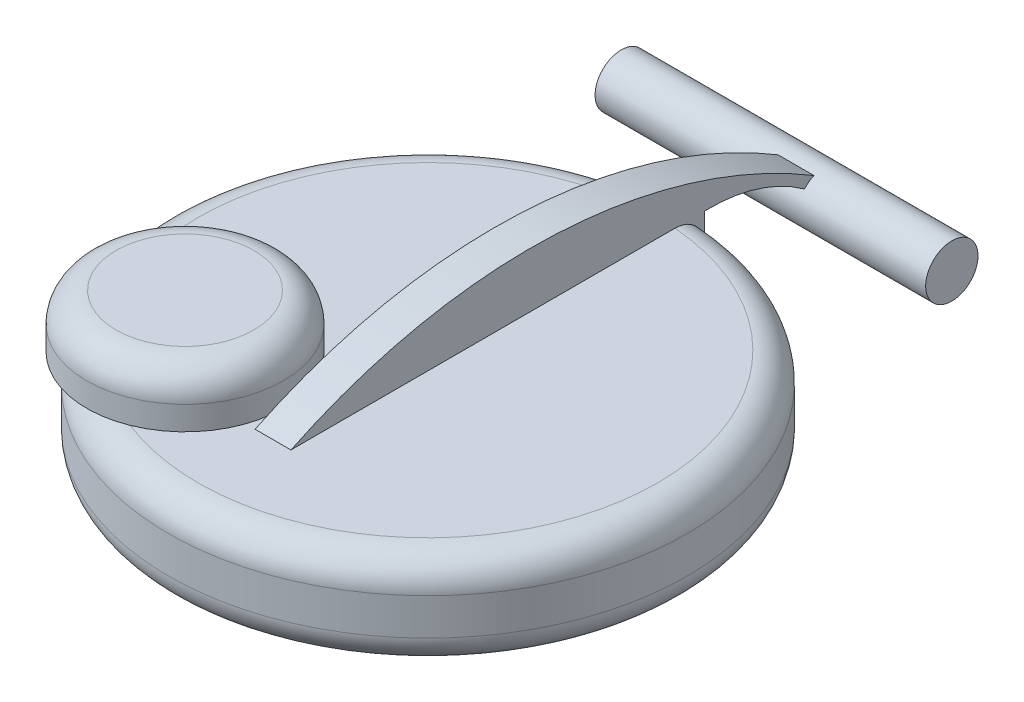
ISO-10303-21;
HEADER;
FILE_DESCRIPTION(('STEP AP214'),'2;1');
FILE_NAME('part.step','',(''),(''),'','','');
FILE_SCHEMA(('AUTOMOTIVE_DESIGN { 1 0 10303 214 1 1 1 1 }'));
ENDSEC;
DATA;
#1=APPLICATION_CONTEXT('core data for automotive mechanical design processes');
#2=APPLICATION_PROTOCOL_DEFINITION('international standard','automotive_design',2000,#1);
#3=PRODUCT_CONTEXT('',#1,'mechanical');
#4=PRODUCT('Part','Part','',(#3));
#5=PRODUCT_RELATED_PRODUCT_CATEGORY('part','',(#4));
#6=PRODUCT_DEFINITION_FORMATION('','',#4);
#7=PRODUCT_DEFINITION_CONTEXT('part definition',#1,'design');
#8=PRODUCT_DEFINITION('design','',#6,#7);
#9=PRODUCT_DEFINITION_SHAPE('','',#8);
#10=(LENGTH_UNIT() NAMED_UNIT(*) SI_UNIT(.MILLI.,.METRE.));
#11=(NAMED_UNIT(*) PLANE_ANGLE_UNIT() SI_UNIT($,.RADIAN.));
#12=(NAMED_UNIT(*) SI_UNIT($,.STERADIAN.) SOLID_ANGLE_UNIT());
#13=UNCERTAINTY_MEASURE_WITH_UNIT(LENGTH_MEASURE(1.E-05),#10,'distance_accuracy_value','');
#14=(GEOMETRIC_REPRESENTATION_CONTEXT(3) GLOBAL_UNCERTAINTY_ASSIGNED_CONTEXT((#13)) GLOBAL_UNIT_ASSIGNED_CONTEXT((#10,
#11,#12)) REPRESENTATION_CONTEXT('',''));
#15=CARTESIAN_POINT('',(0.,0.,0.));
#16=DIRECTION('',(0.,0.,1.));
#17=DIRECTION('',(1.,0.,0.));
#18=AXIS2_PLACEMENT_3D('',#15,#16,#17);
#19=CARTESIAN_POINT('',(14.4526,4.1402,46.101));
#20=DIRECTION('',(0.,-1.,0.));
#21=DIRECTION('',(0.,0.,-1.));
#22=AXIS2_PLACEMENT_3D('',#19,#20,#21);
#23=PLANE('',#22);
#24=DIRECTION('',(1.,0.,0.));
#25=VECTOR('',#24,1.);
#26=CARTESIAN_POINT('',(14.4526,4.1402,10.3124));
#27=LINE('',#26,#25);
#28=CARTESIAN_POINT('',(14.4526,4.1402,10.3124));
#29=VERTEX_POINT('',#28);
#30=CARTESIAN_POINT('',(16.002,4.1402,10.3124));
#31=VERTEX_POINT('',#30);
#32=EDGE_CURVE('E164',#29,#31,#27,.T.);
#33=ORIENTED_EDGE('',*,*,#32,.T.);
#34=CARTESIAN_POINT('',(16.002,4.1402,32.7152));
#35=DIRECTION('',(0.,-1.,0.));
#36=DIRECTION('',(0.,0.,-1.));
#37=AXIS2_PLACEMENT_3D('',#34,#35,#36);
#38=CIRCLE('',#37,22.4028);
#39=CARTESIAN_POINT('',(14.4526,4.1402,10.3660432490172));
#40=VERTEX_POINT('',#39);
#41=EDGE_CURVE('E127',#40,#31,#38,.T.);
#42=ORIENTED_EDGE('',*,*,#41,.F.);
#43=DIRECTION('',(0.,0.,-1.));
#44=VECTOR('',#43,1.);
#45=CARTESIAN_POINT('',(14.4526,4.1402,46.101));
#46=LINE('',#45,#44);
#47=EDGE_CURVE('E144',#40,#29,#46,.T.);
#48=ORIENTED_EDGE('',*,*,#47,.T.);
#49=EDGE_LOOP('',(#33,#42,#48));
#50=FACE_BOUND('',#49,.T.);
#51=ADVANCED_FACE('F39',(#50),#23,.T.);
#52=CARTESIAN_POINT('',(28.575,0.,0.));
#53=DIRECTION('',(-1.,0.,0.));
#54=DIRECTION('',(0.,0.,1.));
#55=AXIS2_PLACEMENT_3D('',#52,#53,#54);
#56=CYLINDRICAL_SURFACE('',#55,2.2606);
#57=DIRECTION('',(1.,0.,0.));
#58=VECTOR('',#57,1.);
#59=CARTESIAN_POINT('',(16.002,1.47437509997745,1.71363077253138));
#60=LINE('',#59,#58);
#61=CARTESIAN_POINT('',(17.5514,1.47437509997744,1.71363077253137));
#62=VERTEX_POINT('',#61);
#63=CARTESIAN_POINT('',(14.4526,1.47437509997745,1.71363077253138));
#64=VERTEX_POINT('',#63);
#65=EDGE_CURVE('E184',#62,#64,#60,.F.);
#66=ORIENTED_EDGE('',*,*,#65,.T.);
#67=CARTESIAN_POINT('',(14.4526,0.,0.));
#68=DIRECTION('',(-1.,0.,0.));
#69=DIRECTION('',(0.,0.,1.));
#70=AXIS2_PLACEMENT_3D('',#67,#68,#69);
#71=CIRCLE('',#70,2.2606);
#72=CARTESIAN_POINT('',(14.4526,2.07691899563761,0.892591645468208));
#73=VERTEX_POINT('',#72);
#74=EDGE_CURVE('E190',#64,#73,#71,.T.);
#75=ORIENTED_EDGE('',*,*,#74,.T.);
#76=DIRECTION('',(1.,0.,0.));
#77=VECTOR('',#76,1.);
#78=CARTESIAN_POINT('',(16.002,2.07691899563761,0.892591645468205));
#79=LINE('',#78,#77);
#80=CARTESIAN_POINT('',(17.5514,2.07691899563765,0.892591645468271));
#81=VERTEX_POINT('',#80);
#82=EDGE_CURVE('E187',#73,#81,#79,.T.);
#83=ORIENTED_EDGE('',*,*,#82,.T.);
#84=CARTESIAN_POINT('',(17.5514,0.,0.));
#85=DIRECTION('',(-1.,0.,0.));
#86=DIRECTION('',(0.,0.,1.));
#87=AXIS2_PLACEMENT_3D('',#84,#85,#86);
#88=CIRCLE('',#87,2.2606);
#89=EDGE_CURVE('E177',#62,#81,#88,.T.);
#90=ORIENTED_EDGE('',*,*,#89,.F.);
#91=EDGE_LOOP('',(#66,#75,#83,#90));
#92=FACE_BOUND('',#91,.T.);
#93=CARTESIAN_POINT('',(28.575,0.,0.));
#94=DIRECTION('',(1.,0.,0.));
#95=DIRECTION('',(0.,0.,-1.));
#96=AXIS2_PLACEMENT_3D('',#93,#94,#95);
#97=CIRCLE('',#96,2.2606);
#98=CARTESIAN_POINT('',(28.575,0.,-2.2606));
#99=VERTEX_POINT('',#98);
#100=EDGE_CURVE('E173',#99,#99,#97,.T.);
#101=ORIENTED_EDGE('',*,*,#100,.F.);
#102=EDGE_LOOP('',(#101));
#103=FACE_BOUND('',#102,.T.);
#104=CARTESIAN_POINT('',(0.,0.,0.));
#105=DIRECTION('',(1.,0.,0.));
#106=DIRECTION('',(0.,0.,-1.));
#107=AXIS2_PLACEMENT_3D('',#104,#105,#106);
#108=CIRCLE('',#107,2.2606);
#109=CARTESIAN_POINT('',(0.,0.,-2.2606));
#110=VERTEX_POINT('',#109);
#111=EDGE_CURVE('E168',#110,#110,#108,.T.);
#112=ORIENTED_EDGE('',*,*,#111,.T.);
#113=EDGE_LOOP('',(#112));
#114=FACE_BOUND('',#113,.T.);
#115=ADVANCED_FACE('F252',(#92,#103,#114),#56,.T.);
#116=CARTESIAN_POINT('',(28.575,0.,0.));
#117=DIRECTION('',(1.,0.,0.));
#118=DIRECTION('',(0.,0.,-1.));
#119=AXIS2_PLACEMENT_3D('',#116,#117,#118);
#120=PLANE('',#119);
#121=ORIENTED_EDGE('',*,*,#100,.T.);
#122=EDGE_LOOP('',(#121));
#123=FACE_BOUND('',#122,.T.);
#124=ADVANCED_FACE('F249',(#123),#120,.T.);
#125=CARTESIAN_POINT('',(0.,0.,0.));
#126=DIRECTION('',(1.,0.,0.));
#127=DIRECTION('',(0.,0.,-1.));
#128=AXIS2_PLACEMENT_3D('',#125,#126,#127);
#129=PLANE('',#128);
#130=ORIENTED_EDGE('',*,*,#111,.F.);
#131=EDGE_LOOP('',(#130));
#132=FACE_BOUND('',#131,.T.);
#133=ADVANCED_FACE('F247',(#132),#129,.F.);
#134=CARTESIAN_POINT('',(14.4526,-38.5602101805096,25.3985301257474));
#135=DIRECTION('',(1.,0.,0.));
#136=DIRECTION('',(0.,0.,-1.));
#137=AXIS2_PLACEMENT_3D('',#134,#135,#136);
#138=CYLINDRICAL_SURFACE('',#137,47.454370594057);
#139=ORIENTED_EDGE('',*,*,#82,.F.);
#140=CARTESIAN_POINT('',(14.4526,-38.5602101805096,25.3985301257474));
#141=DIRECTION('',(1.,0.,0.));
#142=DIRECTION('',(0.,0.,1.));
#143=AXIS2_PLACEMENT_3D('',#140,#141,#142);
#144=CIRCLE('',#143,47.454370594057);
#145=CARTESIAN_POINT('',(14.4526,4.1402,46.101));
#146=VERTEX_POINT('',#145);
#147=EDGE_CURVE('E140',#73,#146,#144,.T.);
#148=ORIENTED_EDGE('',*,*,#147,.T.);
#149=DIRECTION('',(1.,0.,0.));
#150=VECTOR('',#149,1.);
#151=CARTESIAN_POINT('',(14.4526,4.1402,46.101));
#152=LINE('',#151,#150);
#153=CARTESIAN_POINT('',(17.5514,4.1402,46.101));
#154=VERTEX_POINT('',#153);
#155=EDGE_CURVE('E153',#146,#154,#152,.T.);
#156=ORIENTED_EDGE('',*,*,#155,.T.);
#157=CARTESIAN_POINT('',(17.5514,-38.5602101805096,25.3985301257474));
#158=DIRECTION('',(1.,0.,0.));
#159=DIRECTION('',(0.,0.,1.));
#160=AXIS2_PLACEMENT_3D('',#157,#158,#159);
#161=CIRCLE('',#160,47.454370594057);
#162=EDGE_CURVE('E139',#81,#154,#161,.T.);
#163=ORIENTED_EDGE('',*,*,#162,.F.);
#164=EDGE_LOOP('',(#139,#148,#156,#163));
#165=FACE_BOUND('',#164,.T.);
#166=ADVANCED_FACE('F240',(#165),#138,.T.);
#167=CARTESIAN_POINT('',(14.4526,-9.79776043474338,9.92088288389943));
#168=DIRECTION('',(1.,0.,0.));
#169=DIRECTION('',(0.,0.,-1.));
#170=AXIS2_PLACEMENT_3D('',#167,#168,#169);
#171=CYLINDRICAL_SURFACE('',#170,13.9434582056487);
#172=ORIENTED_EDGE('',*,*,#65,.F.);
#173=CARTESIAN_POINT('',(17.5514,-9.79776043474338,9.92088288389943));
#174=DIRECTION('',(-1.,0.,0.));
#175=DIRECTION('',(0.,0.,1.));
#176=AXIS2_PLACEMENT_3D('',#173,#174,#175);
#177=CIRCLE('',#176,13.9434582056487);
#178=CARTESIAN_POINT('',(17.5514,4.1402,10.3124));
#179=VERTEX_POINT('',#178);
#180=EDGE_CURVE('E145',#179,#62,#177,.T.);
#181=ORIENTED_EDGE('',*,*,#180,.F.);
#182=EDGE_CURVE('E169',#31,#179,#27,.T.);
#183=ORIENTED_EDGE('',*,*,#182,.F.);
#184=ORIENTED_EDGE('',*,*,#32,.F.);
#185=CARTESIAN_POINT('',(14.4526,-9.79776043474338,9.92088288389943));
#186=DIRECTION('',(-1.,0.,0.));
#187=DIRECTION('',(0.,0.,1.));
#188=AXIS2_PLACEMENT_3D('',#185,#186,#187);
#189=CIRCLE('',#188,13.9434582056487);
#190=EDGE_CURVE('E149',#29,#64,#189,.T.);
#191=ORIENTED_EDGE('',*,*,#190,.T.);
#192=EDGE_LOOP('',(#172,#181,#183,#184,#191));
#193=FACE_BOUND('',#192,.T.);
#194=ADVANCED_FACE('F237',(#193),#171,.F.);
#195=DIRECTION('',(0.,0.,-1.));
#196=VECTOR('',#195,1.);
#197=CARTESIAN_POINT('',(17.5514,4.1402,46.101));
#198=LINE('',#197,#196);
#199=CARTESIAN_POINT('',(17.5514,4.1402,10.3660432490172));
#200=VERTEX_POINT('',#199);
#201=EDGE_CURVE('E157',#200,#179,#198,.T.);
#202=ORIENTED_EDGE('',*,*,#201,.F.);
#203=EDGE_CURVE('E136',#31,#200,#38,.T.);
#204=ORIENTED_EDGE('',*,*,#203,.F.);
#205=ORIENTED_EDGE('',*,*,#182,.T.);
#206=EDGE_LOOP('',(#202,#204,#205));
#207=FACE_BOUND('',#206,.T.);
#208=ADVANCED_FACE('F230',(#207),#23,.T.);
#209=CARTESIAN_POINT('',(14.4526,-38.5602101805096,25.3985301257474));
#210=DIRECTION('',(-1.,0.,0.));
#211=DIRECTION('',(0.,0.,1.));
#212=AXIS2_PLACEMENT_3D('',#209,#210,#211);
#213=PLANE('',#212);
#214=ORIENTED_EDGE('',*,*,#74,.F.);
#215=ORIENTED_EDGE('',*,*,#190,.F.);
#216=ORIENTED_EDGE('',*,*,#47,.F.);
#217=DIRECTION('',(0.,1.,0.));
#218=VECTOR('',#217,1.);
#219=CARTESIAN_POINT('',(14.4526,1.6002,10.3660432490172));
#220=LINE('',#219,#218);
#221=CARTESIAN_POINT('',(14.4526,1.6002,10.3660432490172));
#222=VERTEX_POINT('',#221);
#223=EDGE_CURVE('E203',#222,#40,#220,.T.);
#224=ORIENTED_EDGE('',*,*,#223,.F.);
#225=CARTESIAN_POINT('',(14.4526,1.6002,10.3660432490172));
#226=CARTESIAN_POINT('',(14.4526,1.67151299293503,10.3660363085651));
#227=CARTESIAN_POINT('',(14.4526,1.74282269499482,10.3690537012884));
#228=CARTESIAN_POINT('',(14.4526,1.88493102473838,10.3810834642439));
#229=CARTESIAN_POINT('',(14.4526,1.9557296789337,10.3900955211994));
#230=CARTESIAN_POINT('',(14.4526,2.09626145821158,10.4140511291829));
#231=CARTESIAN_POINT('',(14.4526,2.16599540777651,10.4289898206368));
#232=CARTESIAN_POINT('',(14.4526,2.30393981269864,10.4646761444001));
#233=CARTESIAN_POINT('',(14.4526,2.37215028541877,10.4854237104697));
#234=CARTESIAN_POINT('',(14.4526,2.57383582424151,10.5562084552872));
#235=CARTESIAN_POINT('',(14.4526,2.70442529802485,10.6147980152304));
#236=CARTESIAN_POINT('',(14.4526,2.95383299088215,10.7530106654435));
#237=CARTESIAN_POINT('',(14.4526,3.0726530748109,10.8326304161346));
#238=CARTESIAN_POINT('',(14.4526,3.29540326918052,11.0107424190602));
#239=CARTESIAN_POINT('',(14.4526,3.3993187634211,11.1092529783754));
#240=CARTESIAN_POINT('',(14.4526,3.58919708109847,11.3223063527935));
#241=CARTESIAN_POINT('',(14.4526,3.67515635205023,11.4368523328947));
#242=CARTESIAN_POINT('',(14.4526,3.82689054531128,11.6789977396257));
#243=CARTESIAN_POINT('',(14.4526,3.89261472705517,11.8066289280003));
#244=CARTESIAN_POINT('',(14.4526,4.00173308598762,12.0710711072069));
#245=CARTESIAN_POINT('',(14.4526,4.04513934742753,12.207877084801));
#246=CARTESIAN_POINT('',(14.4526,4.09786840700542,12.4400540906649));
#247=CARTESIAN_POINT('',(14.4526,4.11373394344092,12.5339921330396));
#248=CARTESIAN_POINT('',(14.4526,4.13489851382628,12.7229150029878));
#249=CARTESIAN_POINT('',(14.4526,4.14021260363175,12.8178981442898));
#250=CARTESIAN_POINT('',(14.4526,4.1402,12.9129227703478));
#251=B_SPLINE_CURVE_WITH_KNOTS('',3,(#225,#226,#227,#228,#229,#230,#231,#232,#233,#234,#235,
#236,#237,#238,#239,#240,#241,#242,#243,#244,#245,#246,#247,#248,#249,#250),.UNSPECIFIED.,.F.,
.F.,(4,2,2,2,2,2,2,2,2,2,2,2,4),(0.,0.213869243519434,0.427727311266985,0.641410386225133,
0.855091024612039,1.28227111379331,1.70938340783218,2.13691172744558,2.56452454993522,
2.99320106163875,3.42164521726373,3.70689703407937,3.99174153182991),.UNSPECIFIED.);
#252=CARTESIAN_POINT('',(14.4526,4.1402,12.9129227703478));
#253=VERTEX_POINT('',#252);
#254=EDGE_CURVE('E210',#222,#253,#251,.T.);
#255=ORIENTED_EDGE('',*,*,#254,.T.);
#256=EDGE_CURVE('E146',#146,#253,#46,.T.);
#257=ORIENTED_EDGE('',*,*,#256,.F.);
#258=ORIENTED_EDGE('',*,*,#147,.F.);
#259=EDGE_LOOP('',(#214,#215,#216,#224,#255,#257,#258));
#260=FACE_BOUND('',#259,.T.);
#261=ADVANCED_FACE('F225',(#260),#213,.T.);
#262=CARTESIAN_POINT('',(17.5514,-38.5602101805096,25.3985301257474));
#263=DIRECTION('',(-1.,0.,0.));
#264=DIRECTION('',(0.,0.,1.));
#265=AXIS2_PLACEMENT_3D('',#262,#263,#264);
#266=PLANE('',#265);
#267=ORIENTED_EDGE('',*,*,#180,.T.);
#268=ORIENTED_EDGE('',*,*,#89,.T.);
#269=ORIENTED_EDGE('',*,*,#162,.T.);
#270=CARTESIAN_POINT('',(17.5514,4.1402,12.9129227703478));
#271=VERTEX_POINT('',#270);
#272=EDGE_CURVE('E158',#154,#271,#198,.T.);
#273=ORIENTED_EDGE('',*,*,#272,.T.);
#274=CARTESIAN_POINT('',(17.5514,4.1402,12.9129227703478));
#275=CARTESIAN_POINT('',(17.5514,4.14020674196776,12.8411366210761));
#276=CARTESIAN_POINT('',(17.5514,4.13717527567335,12.7693535552128));
#277=CARTESIAN_POINT('',(17.5514,4.12508686204146,12.6262992850658));
#278=CARTESIAN_POINT('',(17.5514,4.11603014960157,12.5550280609372));
#279=CARTESIAN_POINT('',(17.5514,4.09195013196919,12.413544264379));
#280=CARTESIAN_POINT('',(17.5514,4.07693077421555,12.3433310233909));
#281=CARTESIAN_POINT('',(17.5514,4.04104453249626,12.2044364247172));
#282=CARTESIAN_POINT('',(17.5514,4.02017773197003,12.135755045188));
#283=CARTESIAN_POINT('',(17.5514,3.94896785061159,11.9326662273362));
#284=CARTESIAN_POINT('',(17.5514,3.89000653895956,11.8011629379402));
#285=CARTESIAN_POINT('',(17.5514,3.75084888892981,11.5500434549842));
#286=CARTESIAN_POINT('',(17.5514,3.67065693401411,11.4304248146203));
#287=CARTESIAN_POINT('',(17.5514,3.49141365520404,11.2065562959163));
#288=CARTESIAN_POINT('',(17.5514,3.39239269665369,11.1022821454912));
#289=CARTESIAN_POINT('',(17.5514,3.17818749814541,10.9118745349783));
#290=CARTESIAN_POINT('',(17.5514,3.06300015580712,10.8257445647692));
#291=CARTESIAN_POINT('',(17.5514,2.82006038306831,10.6743129403552));
#292=CARTESIAN_POINT('',(17.5514,2.69233865271237,10.6089619805216));
#293=CARTESIAN_POINT('',(17.5514,2.42774735069016,10.5007177534429));
#294=CARTESIAN_POINT('',(17.5514,2.2908835210974,10.4578105362979));
#295=CARTESIAN_POINT('',(17.5514,2.06098922968298,10.4065635308956));
#296=CARTESIAN_POINT('',(17.5514,1.96942694980365,10.3913774750094));
#297=CARTESIAN_POINT('',(17.5514,1.78532281158491,10.3711188966836));
#298=CARTESIAN_POINT('',(17.5514,1.69278253643201,10.3660319822686));
#299=CARTESIAN_POINT('',(17.5514,1.6002,10.3660432490172));
#300=B_SPLINE_CURVE_WITH_KNOTS('',3,(#274,#275,#276,#277,#278,#279,#280,#281,#282,#283,#284,
#285,#286,#287,#288,#289,#290,#291,#292,#293,#294,#295,#296,#297,#298,#299),.UNSPECIFIED.,.F.,
.F.,(4,2,2,2,2,2,2,2,2,2,2,2,4),(0.,0.215288846209296,0.430569299754489,0.645707468620923,
0.860842567753671,1.2909589844792,1.72098666481702,2.15032663690255,2.57974911363559,
3.00814489339318,3.43627408656841,3.71419606288952,3.99172169605819),.UNSPECIFIED.);
#301=CARTESIAN_POINT('',(17.5514,1.6002,10.3660432490172));
#302=VERTEX_POINT('',#301);
#303=EDGE_CURVE('E112',#271,#302,#300,.T.);
#304=ORIENTED_EDGE('',*,*,#303,.T.);
#305=DIRECTION('',(0.,1.,0.));
#306=VECTOR('',#305,1.);
#307=CARTESIAN_POINT('',(17.5514,4.1402,10.3660432490172));
#308=LINE('',#307,#306);
#309=EDGE_CURVE('E63',#200,#302,#308,.F.);
#310=ORIENTED_EDGE('',*,*,#309,.F.);
#311=ORIENTED_EDGE('',*,*,#201,.T.);
#312=EDGE_LOOP('',(#267,#268,#269,#273,#304,#310,#311));
#313=FACE_BOUND('',#312,.T.);
#314=ADVANCED_FACE('F229',(#313),#266,.F.);
#315=CARTESIAN_POINT('',(16.002,-4.1148,32.7152));
#316=DIRECTION('',(0.,1.,0.));
#317=DIRECTION('',(0.,0.,1.));
#318=AXIS2_PLACEMENT_3D('',#315,#316,#317);
#319=CYLINDRICAL_SURFACE('',#318,22.4028);
#320=CARTESIAN_POINT('',(16.002,-1.5748,32.7152));
#321=DIRECTION('',(0.,-1.,0.));
#322=DIRECTION('',(0.,0.,-1.));
#323=AXIS2_PLACEMENT_3D('',#320,#321,#322);
#324=CIRCLE('',#323,22.4028);
#325=CARTESIAN_POINT('',(16.002,-1.5748,10.3124));
#326=VERTEX_POINT('',#325);
#327=EDGE_CURVE('E116',#326,#326,#324,.F.);
#328=ORIENTED_EDGE('',*,*,#327,.T.);
#329=EDGE_LOOP('',(#328));
#330=FACE_BOUND('',#329,.T.);
#331=CARTESIAN_POINT('',(16.002,1.6002,32.7152));
#332=DIRECTION('',(0.,-1.,0.));
#333=DIRECTION('',(0.,0.,-1.));
#334=AXIS2_PLACEMENT_3D('',#331,#332,#333);
#335=CIRCLE('',#334,22.4028);
#336=EDGE_CURVE('E199',#302,#222,#335,.T.);
#337=ORIENTED_EDGE('',*,*,#336,.T.);
#338=ORIENTED_EDGE('',*,*,#223,.T.);
#339=ORIENTED_EDGE('',*,*,#41,.T.);
#340=ORIENTED_EDGE('',*,*,#203,.T.);
#341=ORIENTED_EDGE('',*,*,#309,.T.);
#342=EDGE_LOOP('',(#337,#338,#339,#340,#341));
#343=FACE_BOUND('',#342,.T.);
#344=ADVANCED_FACE('F232',(#330,#343),#319,.T.);
#345=CARTESIAN_POINT('',(16.002,-4.1148,32.7152));
#346=DIRECTION('',(0.,-1.,0.));
#347=DIRECTION('',(0.,0.,-1.));
#348=AXIS2_PLACEMENT_3D('',#345,#346,#347);
#349=PLANE('',#348);
#350=CARTESIAN_POINT('',(16.002,-4.1148,32.7152));
#351=DIRECTION('',(0.,-1.,0.));
#352=DIRECTION('',(0.,0.,-1.));
#353=AXIS2_PLACEMENT_3D('',#350,#351,#352);
#354=CIRCLE('',#353,19.8628);
#355=CARTESIAN_POINT('',(16.002,-4.1148,12.8524));
#356=VERTEX_POINT('',#355);
#357=EDGE_CURVE('E193',#356,#356,#354,.T.);
#358=ORIENTED_EDGE('',*,*,#357,.T.);
#359=EDGE_LOOP('',(#358));
#360=FACE_BOUND('',#359,.T.);
#361=ADVANCED_FACE('F266',(#360),#349,.T.);
#362=CARTESIAN_POINT('',(16.002,4.1402,32.7152));
#363=DIRECTION('',(0.,-1.,0.));
#364=DIRECTION('',(0.,0.,-1.));
#365=AXIS2_PLACEMENT_3D('',#362,#363,#364);
#366=PLANE('',#365);
#367=CARTESIAN_POINT('',(5.61488388953715,4.1402,43.3186745157526));
#368=DIRECTION('',(0.,1.,0.));
#369=DIRECTION('',(0.,0.,1.));
#370=AXIS2_PLACEMENT_3D('',#367,#368,#369);
#371=CIRCLE('',#370,8.4963);
#372=CARTESIAN_POINT('',(8.76088015308713,4.1402,51.2110645973267));
#373=VERTEX_POINT('',#372);
#374=CARTESIAN_POINT('',(-2.34067654758648,4.1402,40.3360294109382));
#375=VERTEX_POINT('',#374);
#376=EDGE_CURVE('E120',#373,#375,#371,.T.);
#377=ORIENTED_EDGE('',*,*,#376,.F.);
#378=CARTESIAN_POINT('',(16.002,4.1402,32.7152));
#379=DIRECTION('',(0.,-1.,0.));
#380=DIRECTION('',(0.,0.,-1.));
#381=AXIS2_PLACEMENT_3D('',#378,#379,#380);
#382=CIRCLE('',#381,19.8628);
#383=EDGE_CURVE('E108',#373,#271,#382,.F.);
#384=ORIENTED_EDGE('',*,*,#383,.T.);
#385=ORIENTED_EDGE('',*,*,#272,.F.);
#386=ORIENTED_EDGE('',*,*,#155,.F.);
#387=ORIENTED_EDGE('',*,*,#256,.T.);
#388=EDGE_CURVE('E118',#253,#375,#382,.F.);
#389=ORIENTED_EDGE('',*,*,#388,.T.);
#390=EDGE_LOOP('',(#377,#384,#385,#386,#387,#389));
#391=FACE_BOUND('',#390,.T.);
#392=ADVANCED_FACE('F121',(#391),#366,.F.);
#393=CARTESIAN_POINT('',(16.002,-1.5748,32.7152));
#394=DIRECTION('',(0.,-1.,0.));
#395=DIRECTION('',(0.,0.,-1.));
#396=AXIS2_PLACEMENT_3D('',#393,#394,#395);
#397=TOROIDAL_SURFACE('',#396,19.8628,2.54);
#398=ORIENTED_EDGE('',*,*,#327,.F.);
#399=EDGE_LOOP('',(#398));
#400=FACE_BOUND('',#399,.T.);
#401=ORIENTED_EDGE('',*,*,#357,.F.);
#402=EDGE_LOOP('',(#401));
#403=FACE_BOUND('',#402,.T.);
#404=ADVANCED_FACE('F259',(#400,#403),#397,.T.);
#405=CARTESIAN_POINT('',(16.002,1.6002,32.7152));
#406=DIRECTION('',(0.,-1.,0.));
#407=DIRECTION('',(0.,0.,-1.));
#408=AXIS2_PLACEMENT_3D('',#405,#406,#407);
#409=TOROIDAL_SURFACE('',#408,19.8628,2.54);
#410=ORIENTED_EDGE('',*,*,#303,.F.);
#411=ORIENTED_EDGE('',*,*,#383,.F.);
#412=EDGE_CURVE('E55',#375,#373,#382,.F.);
#413=ORIENTED_EDGE('',*,*,#412,.F.);
#414=ORIENTED_EDGE('',*,*,#388,.F.);
#415=ORIENTED_EDGE('',*,*,#254,.F.);
#416=ORIENTED_EDGE('',*,*,#336,.F.);
#417=EDGE_LOOP('',(#410,#411,#413,#414,#415,#416));
#418=FACE_BOUND('',#417,.T.);
#419=ADVANCED_FACE('F110',(#418),#409,.T.);
#420=CARTESIAN_POINT('',(5.61488388953715,8.7376,43.3186745157526));
#421=DIRECTION('',(0.,-1.,0.));
#422=DIRECTION('',(0.,0.,-1.));
#423=AXIS2_PLACEMENT_3D('',#420,#421,#422);
#424=CYLINDRICAL_SURFACE('',#423,8.4963);
#425=CARTESIAN_POINT('',(5.61488388953715,6.1976,43.3186745157526));
#426=DIRECTION('',(0.,1.,0.));
#427=DIRECTION('',(0.,0.,1.));
#428=AXIS2_PLACEMENT_3D('',#425,#426,#427);
#429=CIRCLE('',#428,8.4963);
#430=CARTESIAN_POINT('',(5.61488388953715,6.1976,51.8149745157526));
#431=VERTEX_POINT('',#430);
#432=EDGE_CURVE('E11',#431,#431,#429,.F.);
#433=ORIENTED_EDGE('',*,*,#432,.T.);
#434=EDGE_LOOP('',(#433));
#435=FACE_BOUND('',#434,.T.);
#436=ORIENTED_EDGE('',*,*,#376,.T.);
#437=EDGE_CURVE('E128',#375,#373,#371,.T.);
#438=ORIENTED_EDGE('',*,*,#437,.T.);
#439=EDGE_LOOP('',(#436,#438));
#440=FACE_BOUND('',#439,.T.);
#441=ADVANCED_FACE('F133',(#435,#440),#424,.T.);
#442=CARTESIAN_POINT('',(5.61488388953715,8.7376,43.3186745157526));
#443=DIRECTION('',(0.,1.,0.));
#444=DIRECTION('',(0.,0.,1.));
#445=AXIS2_PLACEMENT_3D('',#442,#443,#444);
#446=PLANE('',#445);
#447=CARTESIAN_POINT('',(5.61488388953715,8.7376,43.3186745157526));
#448=DIRECTION('',(0.,1.,0.));
#449=DIRECTION('',(0.,0.,1.));
#450=AXIS2_PLACEMENT_3D('',#447,#448,#449);
#451=CIRCLE('',#450,5.9563);
#452=CARTESIAN_POINT('',(5.61488388953715,8.7376,49.2749745157526));
#453=VERTEX_POINT('',#452);
#454=EDGE_CURVE('E48',#453,#453,#451,.T.);
#455=ORIENTED_EDGE('',*,*,#454,.T.);
#456=EDGE_LOOP('',(#455));
#457=FACE_BOUND('',#456,.T.);
#458=ADVANCED_FACE('F299',(#457),#446,.T.);
#459=CARTESIAN_POINT('',(5.61488388953715,4.1402,43.3186745157526));
#460=DIRECTION('',(0.,1.,0.));
#461=DIRECTION('',(0.,0.,1.));
#462=AXIS2_PLACEMENT_3D('',#459,#460,#461);
#463=PLANE('',#462);
#464=ORIENTED_EDGE('',*,*,#437,.F.);
#465=ORIENTED_EDGE('',*,*,#412,.T.);
#466=EDGE_LOOP('',(#464,#465));
#467=FACE_BOUND('',#466,.T.);
#468=ADVANCED_FACE('F131',(#467),#463,.F.);
#469=CARTESIAN_POINT('',(5.61488388953715,6.1976,43.3186745157526));
#470=DIRECTION('',(0.,1.,0.));
#471=DIRECTION('',(0.,0.,1.));
#472=AXIS2_PLACEMENT_3D('',#469,#470,#471);
#473=TOROIDAL_SURFACE('',#472,5.9563,2.54);
#474=ORIENTED_EDGE('',*,*,#432,.F.);
#475=EDGE_LOOP('',(#474));
#476=FACE_BOUND('',#475,.T.);
#477=ORIENTED_EDGE('',*,*,#454,.F.);
#478=EDGE_LOOP('',(#477));
#479=FACE_BOUND('',#478,.T.);
#480=ADVANCED_FACE('F41',(#476,#479),#473,.T.);
#481=CLOSED_SHELL('',(#51,#115,#124,#133,#166,#194,#208,#261,#314,#344,#361,#392,#404,#419,#441,
#458,#468,#480));
#482=MANIFOLD_SOLID_BREP('B2',#481);
#483=ADVANCED_BREP_SHAPE_REPRESENTATION('',(#18,#482),#14);
#484=SHAPE_DEFINITION_REPRESENTATION(#9,#483);
ENDSEC;
END-ISO-10303-21;
